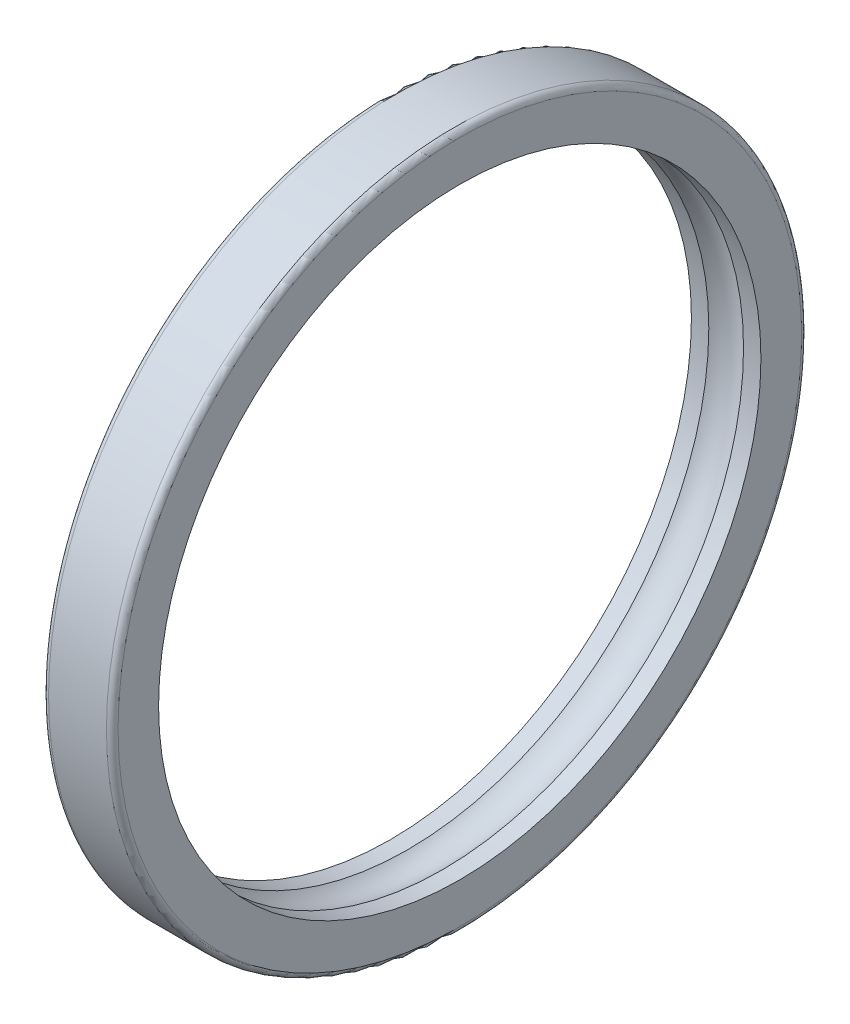
ISO-10303-21;
HEADER;
FILE_DESCRIPTION(('STEP AP214'),'2;1');
FILE_NAME('part.step','',(''),(''),'','','');
FILE_SCHEMA(('AUTOMOTIVE_DESIGN { 1 0 10303 214 1 1 1 1 }'));
ENDSEC;
DATA;
#1=APPLICATION_CONTEXT('core data for automotive mechanical design processes');
#2=APPLICATION_PROTOCOL_DEFINITION('international standard','automotive_design',2000,#1);
#3=PRODUCT_CONTEXT('',#1,'mechanical');
#4=PRODUCT('Part','Part','',(#3));
#5=PRODUCT_RELATED_PRODUCT_CATEGORY('part','',(#4));
#6=PRODUCT_DEFINITION_FORMATION('','',#4);
#7=PRODUCT_DEFINITION_CONTEXT('part definition',#1,'design');
#8=PRODUCT_DEFINITION('design','',#6,#7);
#9=PRODUCT_DEFINITION_SHAPE('','',#8);
#10=(LENGTH_UNIT() NAMED_UNIT(*) SI_UNIT(.MILLI.,.METRE.));
#11=(NAMED_UNIT(*) PLANE_ANGLE_UNIT() SI_UNIT($,.RADIAN.));
#12=(NAMED_UNIT(*) SI_UNIT($,.STERADIAN.) SOLID_ANGLE_UNIT());
#13=UNCERTAINTY_MEASURE_WITH_UNIT(LENGTH_MEASURE(1.E-05),#10,'distance_accuracy_value','');
#14=(GEOMETRIC_REPRESENTATION_CONTEXT(3) GLOBAL_UNCERTAINTY_ASSIGNED_CONTEXT((#13)) GLOBAL_UNIT_ASSIGNED_CONTEXT((#10,
#11,#12)) REPRESENTATION_CONTEXT('',''));
#15=CARTESIAN_POINT('',(0.,0.,0.));
#16=DIRECTION('',(0.,0.,1.));
#17=DIRECTION('',(1.,0.,0.));
#18=AXIS2_PLACEMENT_3D('',#15,#16,#17);
#19=CARTESIAN_POINT('',(-3.81,0.,0.));
#20=DIRECTION('',(-1.,0.,0.));
#21=DIRECTION('',(0.,0.,1.));
#22=AXIS2_PLACEMENT_3D('',#19,#20,#21);
#23=CYLINDRICAL_SURFACE('',#22,33.02);
#24=CARTESIAN_POINT('',(-1.905,0.,0.));
#25=DIRECTION('',(-1.,0.,0.));
#26=DIRECTION('',(0.,0.,1.));
#27=AXIS2_PLACEMENT_3D('',#24,#25,#26);
#28=CIRCLE('',#27,33.02);
#29=CARTESIAN_POINT('',(-1.905,0.,33.02));
#30=VERTEX_POINT('',#29);
#31=EDGE_CURVE('E73',#30,#30,#28,.T.);
#32=ORIENTED_EDGE('',*,*,#31,.F.);
#33=EDGE_LOOP('',(#32));
#34=FACE_BOUND('',#33,.T.);
#35=CARTESIAN_POINT('',(-3.81,0.,0.));
#36=DIRECTION('',(-1.,0.,0.));
#37=DIRECTION('',(0.,0.,1.));
#38=AXIS2_PLACEMENT_3D('',#35,#36,#37);
#39=CIRCLE('',#38,33.02);
#40=CARTESIAN_POINT('',(-3.81,0.,33.02));
#41=VERTEX_POINT('',#40);
#42=EDGE_CURVE('E61',#41,#41,#39,.T.);
#43=ORIENTED_EDGE('',*,*,#42,.T.);
#44=EDGE_LOOP('',(#43));
#45=FACE_BOUND('',#44,.T.);
#46=ADVANCED_FACE('F37',(#34,#45),#23,.F.);
#47=CARTESIAN_POINT('',(-3.81,38.1,0.));
#48=DIRECTION('',(1.,0.,0.));
#49=DIRECTION('',(0.,0.,-1.));
#50=AXIS2_PLACEMENT_3D('',#47,#48,#49);
#51=PLANE('',#50);
#52=CARTESIAN_POINT('',(-3.81,0.,0.));
#53=DIRECTION('',(1.,0.,0.));
#54=DIRECTION('',(0.,0.,-1.));
#55=AXIS2_PLACEMENT_3D('',#52,#53,#54);
#56=CIRCLE('',#55,37.465);
#57=CARTESIAN_POINT('',(-3.81,0.,-37.465));
#58=VERTEX_POINT('',#57);
#59=EDGE_CURVE('E10',#58,#58,#56,.F.);
#60=ORIENTED_EDGE('',*,*,#59,.T.);
#61=EDGE_LOOP('',(#60));
#62=FACE_BOUND('',#61,.T.);
#63=ORIENTED_EDGE('',*,*,#42,.F.);
#64=EDGE_LOOP('',(#63));
#65=FACE_BOUND('',#64,.T.);
#66=ADVANCED_FACE('F82',(#62,#65),#51,.F.);
#67=CARTESIAN_POINT('',(-3.81,0.,0.));
#68=DIRECTION('',(-1.,0.,0.));
#69=DIRECTION('',(0.,0.,1.));
#70=AXIS2_PLACEMENT_3D('',#67,#68,#69);
#71=CYLINDRICAL_SURFACE('',#70,38.1);
#72=CARTESIAN_POINT('',(3.175,0.,0.));
#73=DIRECTION('',(-1.,0.,0.));
#74=DIRECTION('',(0.,0.,1.));
#75=AXIS2_PLACEMENT_3D('',#72,#73,#74);
#76=CIRCLE('',#75,38.1);
#77=CARTESIAN_POINT('',(3.175,0.,38.1));
#78=VERTEX_POINT('',#77);
#79=EDGE_CURVE('E50',#78,#78,#76,.T.);
#80=ORIENTED_EDGE('',*,*,#79,.T.);
#81=EDGE_LOOP('',(#80));
#82=FACE_BOUND('',#81,.T.);
#83=CARTESIAN_POINT('',(-3.175,0.,0.));
#84=DIRECTION('',(1.,0.,0.));
#85=DIRECTION('',(0.,0.,-1.));
#86=AXIS2_PLACEMENT_3D('',#83,#84,#85);
#87=CIRCLE('',#86,38.1);
#88=CARTESIAN_POINT('',(-3.175,0.,-38.1));
#89=VERTEX_POINT('',#88);
#90=EDGE_CURVE('E55',#89,#89,#87,.T.);
#91=ORIENTED_EDGE('',*,*,#90,.T.);
#92=EDGE_LOOP('',(#91));
#93=FACE_BOUND('',#92,.T.);
#94=ADVANCED_FACE('F87',(#82,#93),#71,.T.);
#95=CARTESIAN_POINT('',(3.81,38.1,0.));
#96=DIRECTION('',(-1.,0.,0.));
#97=DIRECTION('',(0.,0.,1.));
#98=AXIS2_PLACEMENT_3D('',#95,#96,#97);
#99=PLANE('',#98);
#100=CARTESIAN_POINT('',(3.81,0.,0.));
#101=DIRECTION('',(-1.,0.,0.));
#102=DIRECTION('',(0.,0.,1.));
#103=AXIS2_PLACEMENT_3D('',#100,#101,#102);
#104=CIRCLE('',#103,37.465);
#105=CARTESIAN_POINT('',(3.81,0.,37.465));
#106=VERTEX_POINT('',#105);
#107=EDGE_CURVE('E45',#106,#106,#104,.F.);
#108=ORIENTED_EDGE('',*,*,#107,.T.);
#109=EDGE_LOOP('',(#108));
#110=FACE_BOUND('',#109,.T.);
#111=CARTESIAN_POINT('',(3.81,0.,0.));
#112=DIRECTION('',(-1.,0.,0.));
#113=DIRECTION('',(0.,0.,1.));
#114=AXIS2_PLACEMENT_3D('',#111,#112,#113);
#115=CIRCLE('',#114,33.02);
#116=CARTESIAN_POINT('',(3.81,0.,33.02));
#117=VERTEX_POINT('',#116);
#118=EDGE_CURVE('E65',#117,#117,#115,.T.);
#119=ORIENTED_EDGE('',*,*,#118,.T.);
#120=EDGE_LOOP('',(#119));
#121=FACE_BOUND('',#120,.T.);
#122=ADVANCED_FACE('F92',(#110,#121),#99,.F.);
#123=CARTESIAN_POINT('',(-3.81,0.,0.));
#124=DIRECTION('',(-1.,0.,0.));
#125=DIRECTION('',(0.,0.,1.));
#126=AXIS2_PLACEMENT_3D('',#123,#124,#125);
#127=CYLINDRICAL_SURFACE('',#126,33.02);
#128=ORIENTED_EDGE('',*,*,#118,.F.);
#129=EDGE_LOOP('',(#128));
#130=FACE_BOUND('',#129,.T.);
#131=CARTESIAN_POINT('',(1.905,0.,0.));
#132=DIRECTION('',(-1.,0.,0.));
#133=DIRECTION('',(0.,0.,1.));
#134=AXIS2_PLACEMENT_3D('',#131,#132,#133);
#135=CIRCLE('',#134,33.02);
#136=CARTESIAN_POINT('',(1.905,0.,33.02));
#137=VERTEX_POINT('',#136);
#138=EDGE_CURVE('E69',#137,#137,#135,.T.);
#139=ORIENTED_EDGE('',*,*,#138,.T.);
#140=EDGE_LOOP('',(#139));
#141=FACE_BOUND('',#140,.T.);
#142=ADVANCED_FACE('F104',(#130,#141),#127,.F.);
#143=CARTESIAN_POINT('',(0.,0.,0.));
#144=DIRECTION('',(-1.,0.,0.));
#145=DIRECTION('',(0.,0.,1.));
#146=AXIS2_PLACEMENT_3D('',#143,#144,#145);
#147=TOROIDAL_SURFACE('',#146,30.48,3.175);
#148=ORIENTED_EDGE('',*,*,#138,.F.);
#149=EDGE_LOOP('',(#148));
#150=FACE_BOUND('',#149,.T.);
#151=ORIENTED_EDGE('',*,*,#31,.T.);
#152=EDGE_LOOP('',(#151));
#153=FACE_BOUND('',#152,.T.);
#154=ADVANCED_FACE('F78',(#150,#153),#147,.F.);
#155=CARTESIAN_POINT('',(3.175,0.,0.));
#156=DIRECTION('',(-1.,0.,0.));
#157=DIRECTION('',(0.,0.,1.));
#158=AXIS2_PLACEMENT_3D('',#155,#156,#157);
#159=TOROIDAL_SURFACE('',#158,37.465,0.635);
#160=ORIENTED_EDGE('',*,*,#107,.F.);
#161=EDGE_LOOP('',(#160));
#162=FACE_BOUND('',#161,.T.);
#163=ORIENTED_EDGE('',*,*,#79,.F.);
#164=EDGE_LOOP('',(#163));
#165=FACE_BOUND('',#164,.T.);
#166=ADVANCED_FACE('F96',(#162,#165),#159,.T.);
#167=CARTESIAN_POINT('',(-3.175,0.,0.));
#168=DIRECTION('',(1.,0.,0.));
#169=DIRECTION('',(0.,0.,-1.));
#170=AXIS2_PLACEMENT_3D('',#167,#168,#169);
#171=TOROIDAL_SURFACE('',#170,37.465,0.635);
#172=ORIENTED_EDGE('',*,*,#90,.F.);
#173=EDGE_LOOP('',(#172));
#174=FACE_BOUND('',#173,.T.);
#175=ORIENTED_EDGE('',*,*,#59,.F.);
#176=EDGE_LOOP('',(#175));
#177=FACE_BOUND('',#176,.T.);
#178=ADVANCED_FACE('F39',(#174,#177),#171,.T.);
#179=CLOSED_SHELL('',(#46,#66,#94,#122,#142,#154,#166,#178));
#180=MANIFOLD_SOLID_BREP('B2',#179);
#181=ADVANCED_BREP_SHAPE_REPRESENTATION('',(#18,#180),#14);
#182=SHAPE_DEFINITION_REPRESENTATION(#9,#181);
ENDSEC;
END-ISO-10303-21;
